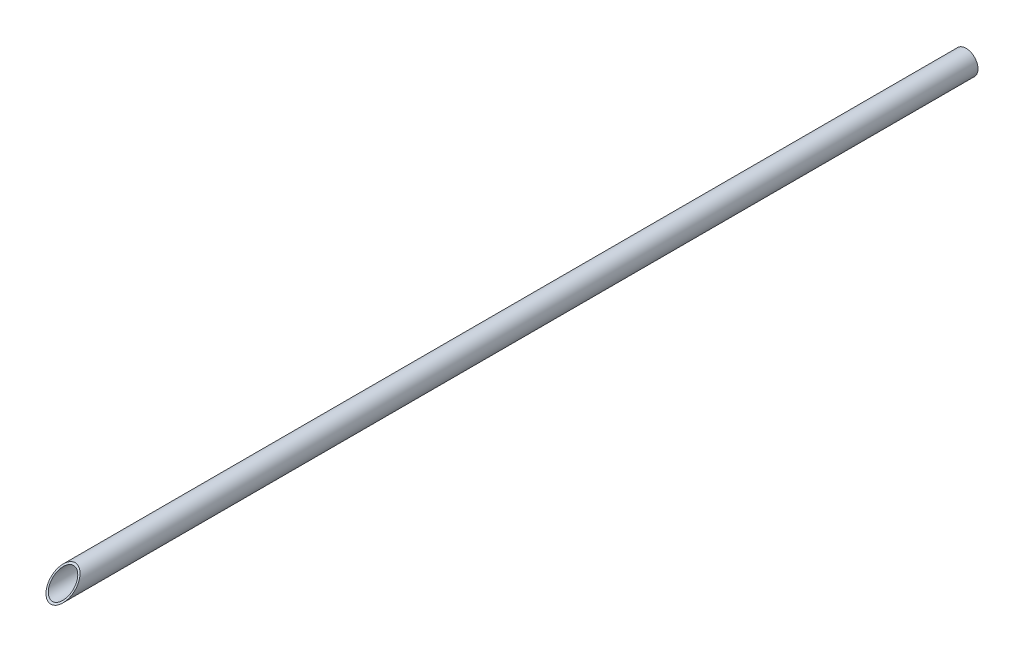
ISO-10303-21;
HEADER;
FILE_DESCRIPTION(('STEP AP214'),'2;1');
FILE_NAME('part.step','',(''),(''),'','','');
FILE_SCHEMA(('AUTOMOTIVE_DESIGN { 1 0 10303 214 1 1 1 1 }'));
ENDSEC;
DATA;
#1=APPLICATION_CONTEXT('core data for automotive mechanical design processes');
#2=APPLICATION_PROTOCOL_DEFINITION('international standard','automotive_design',2000,#1);
#3=PRODUCT_CONTEXT('',#1,'mechanical');
#4=PRODUCT('Part','Part','',(#3));
#5=PRODUCT_RELATED_PRODUCT_CATEGORY('part','',(#4));
#6=PRODUCT_DEFINITION_FORMATION('','',#4);
#7=PRODUCT_DEFINITION_CONTEXT('part definition',#1,'design');
#8=PRODUCT_DEFINITION('design','',#6,#7);
#9=PRODUCT_DEFINITION_SHAPE('','',#8);
#10=(LENGTH_UNIT() NAMED_UNIT(*) SI_UNIT(.MILLI.,.METRE.));
#11=(NAMED_UNIT(*) PLANE_ANGLE_UNIT() SI_UNIT($,.RADIAN.));
#12=(NAMED_UNIT(*) SI_UNIT($,.STERADIAN.) SOLID_ANGLE_UNIT());
#13=UNCERTAINTY_MEASURE_WITH_UNIT(LENGTH_MEASURE(1.E-05),#10,'distance_accuracy_value','');
#14=(GEOMETRIC_REPRESENTATION_CONTEXT(3) GLOBAL_UNCERTAINTY_ASSIGNED_CONTEXT((#13)) GLOBAL_UNIT_ASSIGNED_CONTEXT((#10,
#11,#12)) REPRESENTATION_CONTEXT('',''));
#15=CARTESIAN_POINT('',(0.,0.,0.));
#16=DIRECTION('',(0.,0.,1.));
#17=DIRECTION('',(1.,0.,0.));
#18=AXIS2_PLACEMENT_3D('',#15,#16,#17);
#19=CARTESIAN_POINT('',(0.,0.,1524.));
#20=DIRECTION('',(0.,0.,-1.));
#21=DIRECTION('',(-1.,0.,0.));
#22=AXIS2_PLACEMENT_3D('',#19,#20,#21);
#23=CYLINDRICAL_SURFACE('',#22,19.05);
#24=CARTESIAN_POINT('',(0.,0.,1446.05739989773));
#25=DIRECTION('',(0.,-0.715055013376061,-0.69906818540523));
#26=DIRECTION('',(0.,0.69906818540523,-0.715055013376061));
#27=AXIS2_PLACEMENT_3D('',#24,#25,#26);
#28=ELLIPSE('',#27,27.2505606716421,19.05);
#29=CARTESIAN_POINT('',(0.,19.05,1426.57174987217));
#30=VERTEX_POINT('',#29);
#31=EDGE_CURVE('E43',#30,#30,#28,.T.);
#32=ORIENTED_EDGE('',*,*,#31,.T.);
#33=EDGE_LOOP('',(#32));
#34=FACE_BOUND('',#33,.T.);
#35=CARTESIAN_POINT('',(0.,0.,0.));
#36=DIRECTION('',(0.,0.,1.));
#37=DIRECTION('',(1.,0.,0.));
#38=AXIS2_PLACEMENT_3D('',#35,#36,#37);
#39=CIRCLE('',#38,19.05);
#40=CARTESIAN_POINT('',(19.05,0.,0.));
#41=VERTEX_POINT('',#40);
#42=EDGE_CURVE('E11',#41,#41,#39,.T.);
#43=ORIENTED_EDGE('',*,*,#42,.T.);
#44=EDGE_LOOP('',(#43));
#45=FACE_BOUND('',#44,.T.);
#46=ADVANCED_FACE('F32',(#34,#45),#23,.T.);
#47=CARTESIAN_POINT('',(0.,0.,0.));
#48=DIRECTION('',(0.,0.,1.));
#49=DIRECTION('',(1.,0.,0.));
#50=AXIS2_PLACEMENT_3D('',#47,#48,#49);
#51=PLANE('',#50);
#52=CARTESIAN_POINT('',(0.,0.,0.));
#53=DIRECTION('',(0.,0.,1.));
#54=DIRECTION('',(1.,0.,0.));
#55=AXIS2_PLACEMENT_3D('',#52,#53,#54);
#56=CIRCLE('',#55,16.51);
#57=CARTESIAN_POINT('',(16.51,0.,0.));
#58=VERTEX_POINT('',#57);
#59=EDGE_CURVE('E39',#58,#58,#56,.T.);
#60=ORIENTED_EDGE('',*,*,#59,.T.);
#61=EDGE_LOOP('',(#60));
#62=FACE_BOUND('',#61,.T.);
#63=ORIENTED_EDGE('',*,*,#42,.F.);
#64=EDGE_LOOP('',(#63));
#65=FACE_BOUND('',#64,.T.);
#66=ADVANCED_FACE('F58',(#62,#65),#51,.F.);
#67=CARTESIAN_POINT('',(0.,0.,1524.));
#68=DIRECTION('',(0.,0.,-1.));
#69=DIRECTION('',(-1.,0.,0.));
#70=AXIS2_PLACEMENT_3D('',#67,#68,#69);
#71=CYLINDRICAL_SURFACE('',#70,16.51);
#72=CARTESIAN_POINT('',(0.,0.,1446.05739989773));
#73=DIRECTION('',(0.,-0.715055013376061,-0.69906818540523));
#74=DIRECTION('',(0.,0.69906818540523,-0.715055013376061));
#75=AXIS2_PLACEMENT_3D('',#72,#73,#74);
#76=ELLIPSE('',#75,23.6171525820899,16.51);
#77=CARTESIAN_POINT('',(0.,16.51,1429.16983654224));
#78=VERTEX_POINT('',#77);
#79=EDGE_CURVE('E35',#78,#78,#76,.T.);
#80=ORIENTED_EDGE('',*,*,#79,.F.);
#81=EDGE_LOOP('',(#80));
#82=FACE_BOUND('',#81,.T.);
#83=ORIENTED_EDGE('',*,*,#59,.F.);
#84=EDGE_LOOP('',(#83));
#85=FACE_BOUND('',#84,.T.);
#86=ADVANCED_FACE('F55',(#82,#85),#71,.F.);
#87=CARTESIAN_POINT('',(127.,-76.2000000000002,1524.));
#88=DIRECTION('',(0.,-0.715055013376061,-0.69906818540523));
#89=DIRECTION('',(0.,0.69906818540523,-0.715055013376061));
#90=AXIS2_PLACEMENT_3D('',#87,#88,#89);
#91=PLANE('',#90);
#92=ORIENTED_EDGE('',*,*,#79,.T.);
#93=EDGE_LOOP('',(#92));
#94=FACE_BOUND('',#93,.T.);
#95=ORIENTED_EDGE('',*,*,#31,.F.);
#96=EDGE_LOOP('',(#95));
#97=FACE_BOUND('',#96,.T.);
#98=ADVANCED_FACE('F52',(#94,#97),#91,.F.);
#99=CLOSED_SHELL('',(#46,#66,#86,#98));
#100=MANIFOLD_SOLID_BREP('B2',#99);
#101=ADVANCED_BREP_SHAPE_REPRESENTATION('',(#18,#100),#14);
#102=SHAPE_DEFINITION_REPRESENTATION(#9,#101);
ENDSEC;
END-ISO-10303-21;
